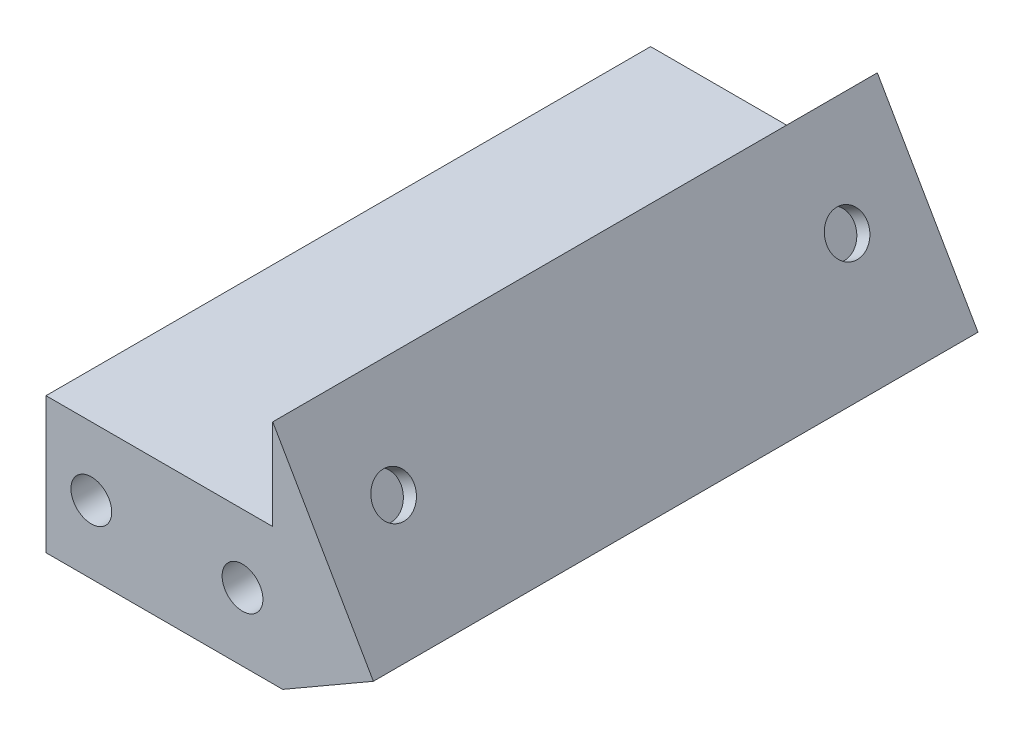
ISO-10303-21;
HEADER;
FILE_DESCRIPTION(('STEP AP214'),'2;1');
FILE_NAME('part.step','',(''),(''),'','','');
FILE_SCHEMA(('AUTOMOTIVE_DESIGN { 1 0 10303 214 1 1 1 1 }'));
ENDSEC;
DATA;
#1=APPLICATION_CONTEXT('core data for automotive mechanical design processes');
#2=APPLICATION_PROTOCOL_DEFINITION('international standard','automotive_design',2000,#1);
#3=PRODUCT_CONTEXT('',#1,'mechanical');
#4=PRODUCT('Part','Part','',(#3));
#5=PRODUCT_RELATED_PRODUCT_CATEGORY('part','',(#4));
#6=PRODUCT_DEFINITION_FORMATION('','',#4);
#7=PRODUCT_DEFINITION_CONTEXT('part definition',#1,'design');
#8=PRODUCT_DEFINITION('design','',#6,#7);
#9=PRODUCT_DEFINITION_SHAPE('','',#8);
#10=(LENGTH_UNIT() NAMED_UNIT(*) SI_UNIT(.MILLI.,.METRE.));
#11=(NAMED_UNIT(*) PLANE_ANGLE_UNIT() SI_UNIT($,.RADIAN.));
#12=(NAMED_UNIT(*) SI_UNIT($,.STERADIAN.) SOLID_ANGLE_UNIT());
#13=UNCERTAINTY_MEASURE_WITH_UNIT(LENGTH_MEASURE(1.E-05),#10,'distance_accuracy_value','');
#14=(GEOMETRIC_REPRESENTATION_CONTEXT(3) GLOBAL_UNCERTAINTY_ASSIGNED_CONTEXT((#13)) GLOBAL_UNIT_ASSIGNED_CONTEXT((#10,
#11,#12)) REPRESENTATION_CONTEXT('',''));
#15=CARTESIAN_POINT('',(0.,0.,0.));
#16=DIRECTION('',(0.,0.,1.));
#17=DIRECTION('',(1.,0.,0.));
#18=AXIS2_PLACEMENT_3D('',#15,#16,#17);
#19=CARTESIAN_POINT('',(0.,0.,40.));
#20=DIRECTION('',(1.,0.,0.));
#21=DIRECTION('',(0.,1.,0.));
#22=AXIS2_PLACEMENT_3D('',#19,#20,#21);
#23=PLANE('',#22);
#24=DIRECTION('',(0.,-1.,0.));
#25=VECTOR('',#24,1.);
#26=CARTESIAN_POINT('',(0.,0.,0.));
#27=LINE('',#26,#25);
#28=CARTESIAN_POINT('',(0.,0.,0.));
#29=VERTEX_POINT('',#28);
#30=CARTESIAN_POINT('',(0.,-8.99999999999998,0.));
#31=VERTEX_POINT('',#30);
#32=EDGE_CURVE('E117',#29,#31,#27,.T.);
#33=ORIENTED_EDGE('',*,*,#32,.T.);
#34=DIRECTION('',(0.,0.,-1.));
#35=VECTOR('',#34,1.);
#36=CARTESIAN_POINT('',(0.,-8.99999999999998,40.));
#37=LINE('',#36,#35);
#38=CARTESIAN_POINT('',(0.,-8.99999999999998,40.));
#39=VERTEX_POINT('',#38);
#40=EDGE_CURVE('E11',#39,#31,#37,.T.);
#41=ORIENTED_EDGE('',*,*,#40,.F.);
#42=DIRECTION('',(0.,-1.,0.));
#43=VECTOR('',#42,1.);
#44=CARTESIAN_POINT('',(0.,0.,40.));
#45=LINE('',#44,#43);
#46=CARTESIAN_POINT('',(0.,0.,40.));
#47=VERTEX_POINT('',#46);
#48=EDGE_CURVE('E128',#47,#39,#45,.T.);
#49=ORIENTED_EDGE('',*,*,#48,.F.);
#50=DIRECTION('',(0.,0.,-1.));
#51=VECTOR('',#50,1.);
#52=CARTESIAN_POINT('',(0.,0.,40.));
#53=LINE('',#52,#51);
#54=EDGE_CURVE('E113',#47,#29,#53,.T.);
#55=ORIENTED_EDGE('',*,*,#54,.T.);
#56=EDGE_LOOP('',(#33,#41,#49,#55));
#57=FACE_BOUND('',#56,.T.);
#58=ADVANCED_FACE('F33',(#57),#23,.F.);
#59=CARTESIAN_POINT('',(0.,-8.99999999999998,40.));
#60=DIRECTION('',(0.,1.,0.));
#61=DIRECTION('',(-1.,0.,0.));
#62=AXIS2_PLACEMENT_3D('',#59,#60,#61);
#63=PLANE('',#62);
#64=DIRECTION('',(1.,0.,0.));
#65=VECTOR('',#64,1.);
#66=CARTESIAN_POINT('',(0.,-8.99999999999998,0.));
#67=LINE('',#66,#65);
#68=CARTESIAN_POINT('',(15.6602540378444,-8.99999999999998,0.));
#69=VERTEX_POINT('',#68);
#70=EDGE_CURVE('E120',#31,#69,#67,.T.);
#71=ORIENTED_EDGE('',*,*,#70,.T.);
#72=DIRECTION('',(0.,0.,-1.));
#73=VECTOR('',#72,1.);
#74=CARTESIAN_POINT('',(15.6602540378444,-8.99999999999998,40.));
#75=LINE('',#74,#73);
#76=CARTESIAN_POINT('',(15.6602540378444,-8.99999999999998,40.));
#77=VERTEX_POINT('',#76);
#78=EDGE_CURVE('E41',#77,#69,#75,.T.);
#79=ORIENTED_EDGE('',*,*,#78,.F.);
#80=DIRECTION('',(1.,0.,0.));
#81=VECTOR('',#80,1.);
#82=CARTESIAN_POINT('',(0.,-8.99999999999998,40.));
#83=LINE('',#82,#81);
#84=EDGE_CURVE('E86',#39,#77,#83,.T.);
#85=ORIENTED_EDGE('',*,*,#84,.F.);
#86=ORIENTED_EDGE('',*,*,#40,.T.);
#87=EDGE_LOOP('',(#71,#79,#85,#86));
#88=FACE_BOUND('',#87,.T.);
#89=ADVANCED_FACE('F154',(#88),#63,.F.);
#90=CARTESIAN_POINT('',(21.6602540378444,-5.53589838486222,40.));
#91=DIRECTION('',(-0.5,0.866025403784439,0.));
#92=DIRECTION('',(-0.866025403784439,-0.5,0.));
#93=AXIS2_PLACEMENT_3D('',#90,#91,#92);
#94=PLANE('',#93);
#95=DIRECTION('',(0.866025403784439,0.5,0.));
#96=VECTOR('',#95,1.);
#97=CARTESIAN_POINT('',(21.6602540378444,-5.53589838486222,0.));
#98=LINE('',#97,#96);
#99=CARTESIAN_POINT('',(21.6602540378444,-5.53589838486222,0.));
#100=VERTEX_POINT('',#99);
#101=EDGE_CURVE('E123',#69,#100,#98,.T.);
#102=ORIENTED_EDGE('',*,*,#101,.T.);
#103=DIRECTION('',(0.,0.,-1.));
#104=VECTOR('',#103,1.);
#105=CARTESIAN_POINT('',(21.6602540378444,-5.53589838486222,40.));
#106=LINE('',#105,#104);
#107=CARTESIAN_POINT('',(21.6602540378444,-5.53589838486222,40.));
#108=VERTEX_POINT('',#107);
#109=EDGE_CURVE('E108',#108,#100,#106,.T.);
#110=ORIENTED_EDGE('',*,*,#109,.F.);
#111=DIRECTION('',(0.866025403784439,0.5,0.));
#112=VECTOR('',#111,1.);
#113=CARTESIAN_POINT('',(21.6602540378444,-5.53589838486222,40.));
#114=LINE('',#113,#112);
#115=EDGE_CURVE('E99',#77,#108,#114,.T.);
#116=ORIENTED_EDGE('',*,*,#115,.F.);
#117=ORIENTED_EDGE('',*,*,#78,.T.);
#118=EDGE_LOOP('',(#102,#110,#116,#117));
#119=FACE_BOUND('',#118,.T.);
#120=ADVANCED_FACE('F134',(#119),#94,.F.);
#121=CARTESIAN_POINT('',(15.,6.,40.));
#122=DIRECTION('',(-0.866025403784439,-0.5,0.));
#123=DIRECTION('',(0.5,-0.866025403784439,0.));
#124=AXIS2_PLACEMENT_3D('',#121,#122,#123);
#125=PLANE('',#124);
#126=CARTESIAN_POINT('',(18.0000000013533,0.803847574949357,35.));
#127=DIRECTION('',(-0.866025403784439,-0.5,0.));
#128=DIRECTION('',(-0.5,0.866025403784439,0.));
#129=AXIS2_PLACEMENT_3D('',#126,#127,#128);
#130=CIRCLE('',#129,1.35);
#131=CARTESIAN_POINT('',(17.3250000013533,1.97298187005835,35.));
#132=VERTEX_POINT('',#131);
#133=EDGE_CURVE('E170',#132,#132,#130,.T.);
#134=ORIENTED_EDGE('',*,*,#133,.T.);
#135=EDGE_LOOP('',(#134));
#136=FACE_BOUND('',#135,.T.);
#137=CARTESIAN_POINT('',(18.0000000013533,0.803847574949357,5.));
#138=DIRECTION('',(0.866025403784439,0.5,0.));
#139=DIRECTION('',(-0.5,0.866025403784439,0.));
#140=AXIS2_PLACEMENT_3D('',#137,#138,#139);
#141=CIRCLE('',#140,1.35);
#142=CARTESIAN_POINT('',(17.3250000013533,1.97298187005835,5.));
#143=VERTEX_POINT('',#142);
#144=EDGE_CURVE('E173',#143,#143,#141,.T.);
#145=ORIENTED_EDGE('',*,*,#144,.F.);
#146=EDGE_LOOP('',(#145));
#147=FACE_BOUND('',#146,.T.);
#148=DIRECTION('',(-0.5,0.866025403784439,0.));
#149=VECTOR('',#148,1.);
#150=CARTESIAN_POINT('',(15.,6.,0.));
#151=LINE('',#150,#149);
#152=CARTESIAN_POINT('',(15.,6.,0.));
#153=VERTEX_POINT('',#152);
#154=EDGE_CURVE('E107',#100,#153,#151,.T.);
#155=ORIENTED_EDGE('',*,*,#154,.T.);
#156=DIRECTION('',(0.,0.,-1.));
#157=VECTOR('',#156,1.);
#158=CARTESIAN_POINT('',(15.,6.,40.));
#159=LINE('',#158,#157);
#160=CARTESIAN_POINT('',(15.,6.,40.));
#161=VERTEX_POINT('',#160);
#162=EDGE_CURVE('E104',#161,#153,#159,.T.);
#163=ORIENTED_EDGE('',*,*,#162,.F.);
#164=DIRECTION('',(-0.5,0.866025403784439,0.));
#165=VECTOR('',#164,1.);
#166=CARTESIAN_POINT('',(15.,6.,40.));
#167=LINE('',#166,#165);
#168=EDGE_CURVE('E93',#108,#161,#167,.T.);
#169=ORIENTED_EDGE('',*,*,#168,.F.);
#170=ORIENTED_EDGE('',*,*,#109,.T.);
#171=EDGE_LOOP('',(#155,#163,#169,#170));
#172=FACE_BOUND('',#171,.T.);
#173=ADVANCED_FACE('F105',(#136,#147,#172),#125,.F.);
#174=CARTESIAN_POINT('',(15.,0.,40.));
#175=DIRECTION('',(1.,0.,0.));
#176=DIRECTION('',(0.,0.,-1.));
#177=AXIS2_PLACEMENT_3D('',#174,#175,#176);
#178=PLANE('',#177);
#179=DIRECTION('',(0.,-1.,0.));
#180=VECTOR('',#179,1.);
#181=CARTESIAN_POINT('',(15.,0.,0.));
#182=LINE('',#181,#180);
#183=CARTESIAN_POINT('',(15.,0.,0.));
#184=VERTEX_POINT('',#183);
#185=EDGE_CURVE('E72',#153,#184,#182,.T.);
#186=ORIENTED_EDGE('',*,*,#185,.T.);
#187=DIRECTION('',(0.,0.,-1.));
#188=VECTOR('',#187,1.);
#189=CARTESIAN_POINT('',(15.,0.,40.));
#190=LINE('',#189,#188);
#191=CARTESIAN_POINT('',(15.,0.,40.));
#192=VERTEX_POINT('',#191);
#193=EDGE_CURVE('E109',#192,#184,#190,.T.);
#194=ORIENTED_EDGE('',*,*,#193,.F.);
#195=DIRECTION('',(0.,-1.,0.));
#196=VECTOR('',#195,1.);
#197=CARTESIAN_POINT('',(15.,0.,40.));
#198=LINE('',#197,#196);
#199=EDGE_CURVE('E97',#161,#192,#198,.T.);
#200=ORIENTED_EDGE('',*,*,#199,.F.);
#201=ORIENTED_EDGE('',*,*,#162,.T.);
#202=EDGE_LOOP('',(#186,#194,#200,#201));
#203=FACE_BOUND('',#202,.T.);
#204=ADVANCED_FACE('F111',(#203),#178,.F.);
#205=CARTESIAN_POINT('',(0.,0.,40.));
#206=DIRECTION('',(0.,-1.,0.));
#207=DIRECTION('',(0.,0.,-1.));
#208=AXIS2_PLACEMENT_3D('',#205,#206,#207);
#209=PLANE('',#208);
#210=DIRECTION('',(-1.,0.,0.));
#211=VECTOR('',#210,1.);
#212=CARTESIAN_POINT('',(0.,0.,0.));
#213=LINE('',#212,#211);
#214=EDGE_CURVE('E78',#184,#29,#213,.T.);
#215=ORIENTED_EDGE('',*,*,#214,.T.);
#216=ORIENTED_EDGE('',*,*,#54,.F.);
#217=DIRECTION('',(-1.,0.,0.));
#218=VECTOR('',#217,1.);
#219=CARTESIAN_POINT('',(0.,0.,40.));
#220=LINE('',#219,#218);
#221=EDGE_CURVE('E49',#192,#47,#220,.T.);
#222=ORIENTED_EDGE('',*,*,#221,.F.);
#223=ORIENTED_EDGE('',*,*,#193,.T.);
#224=EDGE_LOOP('',(#215,#216,#222,#223));
#225=FACE_BOUND('',#224,.T.);
#226=ADVANCED_FACE('F141',(#225),#209,.F.);
#227=CARTESIAN_POINT('',(0.,0.,40.));
#228=DIRECTION('',(0.,0.,1.));
#229=DIRECTION('',(1.,0.,0.));
#230=AXIS2_PLACEMENT_3D('',#227,#228,#229);
#231=PLANE('',#230);
#232=CARTESIAN_POINT('',(13.,-4.49999999999999,40.));
#233=DIRECTION('',(0.,0.,1.));
#234=DIRECTION('',(1.,0.,0.));
#235=AXIS2_PLACEMENT_3D('',#232,#233,#234);
#236=CIRCLE('',#235,1.35);
#237=CARTESIAN_POINT('',(14.35,-4.49999999999999,40.));
#238=VERTEX_POINT('',#237);
#239=EDGE_CURVE('E192',#238,#238,#236,.T.);
#240=ORIENTED_EDGE('',*,*,#239,.F.);
#241=EDGE_LOOP('',(#240));
#242=FACE_BOUND('',#241,.T.);
#243=CARTESIAN_POINT('',(3.,-4.49999999999999,40.));
#244=DIRECTION('',(0.,0.,1.));
#245=DIRECTION('',(1.,0.,0.));
#246=AXIS2_PLACEMENT_3D('',#243,#244,#245);
#247=CIRCLE('',#246,1.35);
#248=CARTESIAN_POINT('',(4.35,-4.49999999999999,40.));
#249=VERTEX_POINT('',#248);
#250=EDGE_CURVE('E186',#249,#249,#247,.T.);
#251=ORIENTED_EDGE('',*,*,#250,.F.);
#252=EDGE_LOOP('',(#251));
#253=FACE_BOUND('',#252,.T.);
#254=ORIENTED_EDGE('',*,*,#48,.T.);
#255=ORIENTED_EDGE('',*,*,#84,.T.);
#256=ORIENTED_EDGE('',*,*,#115,.T.);
#257=ORIENTED_EDGE('',*,*,#168,.T.);
#258=ORIENTED_EDGE('',*,*,#199,.T.);
#259=ORIENTED_EDGE('',*,*,#221,.T.);
#260=EDGE_LOOP('',(#254,#255,#256,#257,#258,#259));
#261=FACE_BOUND('',#260,.T.);
#262=ADVANCED_FACE('F95',(#242,#253,#261),#231,.T.);
#263=CARTESIAN_POINT('',(0.,0.,0.));
#264=DIRECTION('',(0.,0.,1.));
#265=DIRECTION('',(1.,0.,0.));
#266=AXIS2_PLACEMENT_3D('',#263,#264,#265);
#267=PLANE('',#266);
#268=CARTESIAN_POINT('',(13.,-4.49999999999999,0.));
#269=DIRECTION('',(0.,0.,1.));
#270=DIRECTION('',(1.,0.,0.));
#271=AXIS2_PLACEMENT_3D('',#268,#269,#270);
#272=CIRCLE('',#271,1.35);
#273=CARTESIAN_POINT('',(14.35,-4.49999999999999,0.));
#274=VERTEX_POINT('',#273);
#275=EDGE_CURVE('E189',#274,#274,#272,.T.);
#276=ORIENTED_EDGE('',*,*,#275,.T.);
#277=EDGE_LOOP('',(#276));
#278=FACE_BOUND('',#277,.T.);
#279=CARTESIAN_POINT('',(3.,-4.49999999999999,0.));
#280=DIRECTION('',(0.,0.,1.));
#281=DIRECTION('',(1.,0.,0.));
#282=AXIS2_PLACEMENT_3D('',#279,#280,#281);
#283=CIRCLE('',#282,1.35);
#284=CARTESIAN_POINT('',(4.35,-4.49999999999999,0.));
#285=VERTEX_POINT('',#284);
#286=EDGE_CURVE('E184',#285,#285,#283,.T.);
#287=ORIENTED_EDGE('',*,*,#286,.T.);
#288=EDGE_LOOP('',(#287));
#289=FACE_BOUND('',#288,.T.);
#290=ORIENTED_EDGE('',*,*,#32,.F.);
#291=ORIENTED_EDGE('',*,*,#214,.F.);
#292=ORIENTED_EDGE('',*,*,#185,.F.);
#293=ORIENTED_EDGE('',*,*,#154,.F.);
#294=ORIENTED_EDGE('',*,*,#101,.F.);
#295=ORIENTED_EDGE('',*,*,#70,.F.);
#296=EDGE_LOOP('',(#290,#291,#292,#293,#294,#295));
#297=FACE_BOUND('',#296,.T.);
#298=ADVANCED_FACE('F137',(#278,#289,#297),#267,.F.);
#299=CARTESIAN_POINT('',(17.1339745975689,0.303847574949357,5.));
#300=DIRECTION('',(0.866025403784439,0.5,0.));
#301=DIRECTION('',(-0.5,0.866025403784439,0.));
#302=AXIS2_PLACEMENT_3D('',#299,#300,#301);
#303=CYLINDRICAL_SURFACE('',#302,1.35);
#304=CARTESIAN_POINT('',(17.1339745975689,0.303847574949357,5.));
#305=DIRECTION('',(0.866025403784439,0.5,0.));
#306=DIRECTION('',(-0.5,0.866025403784439,0.));
#307=AXIS2_PLACEMENT_3D('',#304,#305,#306);
#308=CIRCLE('',#307,1.35);
#309=CARTESIAN_POINT('',(16.4589745975689,1.47298187005835,5.));
#310=VERTEX_POINT('',#309);
#311=EDGE_CURVE('E121',#310,#310,#308,.T.);
#312=ORIENTED_EDGE('',*,*,#311,.F.);
#313=EDGE_LOOP('',(#312));
#314=FACE_BOUND('',#313,.T.);
#315=ORIENTED_EDGE('',*,*,#144,.T.);
#316=EDGE_LOOP('',(#315));
#317=FACE_BOUND('',#316,.T.);
#318=ADVANCED_FACE('F227',(#314,#317),#303,.F.);
#319=CARTESIAN_POINT('',(17.1339745975689,0.303847574949357,5.));
#320=DIRECTION('',(0.866025403784439,0.5,0.));
#321=DIRECTION('',(-0.5,0.866025403784439,0.));
#322=AXIS2_PLACEMENT_3D('',#319,#320,#321);
#323=PLANE('',#322);
#324=ORIENTED_EDGE('',*,*,#311,.T.);
#325=EDGE_LOOP('',(#324));
#326=FACE_BOUND('',#325,.T.);
#327=ADVANCED_FACE('F223',(#326),#323,.T.);
#328=CARTESIAN_POINT('',(17.1339745975689,0.303847574949357,35.));
#329=DIRECTION('',(0.866025403784439,0.5,0.));
#330=DIRECTION('',(-0.5,0.866025403784439,0.));
#331=AXIS2_PLACEMENT_3D('',#328,#329,#330);
#332=CYLINDRICAL_SURFACE('',#331,1.35);
#333=CARTESIAN_POINT('',(17.1339745975689,0.303847574949357,35.));
#334=DIRECTION('',(-0.866025403784439,-0.5,0.));
#335=DIRECTION('',(-0.5,0.866025403784439,0.));
#336=AXIS2_PLACEMENT_3D('',#333,#334,#335);
#337=CIRCLE('',#336,1.35);
#338=CARTESIAN_POINT('',(16.4589745975689,1.47298187005835,35.));
#339=VERTEX_POINT('',#338);
#340=EDGE_CURVE('E175',#339,#339,#337,.T.);
#341=ORIENTED_EDGE('',*,*,#340,.T.);
#342=EDGE_LOOP('',(#341));
#343=FACE_BOUND('',#342,.T.);
#344=ORIENTED_EDGE('',*,*,#133,.F.);
#345=EDGE_LOOP('',(#344));
#346=FACE_BOUND('',#345,.T.);
#347=ADVANCED_FACE('F216',(#343,#346),#332,.F.);
#348=CARTESIAN_POINT('',(17.1339745975689,0.303847574949357,35.));
#349=DIRECTION('',(0.866025403784439,0.5,0.));
#350=DIRECTION('',(-0.5,0.866025403784439,0.));
#351=AXIS2_PLACEMENT_3D('',#348,#349,#350);
#352=PLANE('',#351);
#353=ORIENTED_EDGE('',*,*,#340,.F.);
#354=EDGE_LOOP('',(#353));
#355=FACE_BOUND('',#354,.T.);
#356=ADVANCED_FACE('F210',(#355),#352,.T.);
#357=CARTESIAN_POINT('',(3.,-4.49999999999999,0.));
#358=DIRECTION('',(0.,0.,1.));
#359=DIRECTION('',(1.,0.,0.));
#360=AXIS2_PLACEMENT_3D('',#357,#358,#359);
#361=CYLINDRICAL_SURFACE('',#360,1.35);
#362=ORIENTED_EDGE('',*,*,#286,.F.);
#363=EDGE_LOOP('',(#362));
#364=FACE_BOUND('',#363,.T.);
#365=ORIENTED_EDGE('',*,*,#250,.T.);
#366=EDGE_LOOP('',(#365));
#367=FACE_BOUND('',#366,.T.);
#368=ADVANCED_FACE('F203',(#364,#367),#361,.F.);
#369=CARTESIAN_POINT('',(13.,-4.49999999999999,0.));
#370=DIRECTION('',(0.,0.,1.));
#371=DIRECTION('',(1.,0.,0.));
#372=AXIS2_PLACEMENT_3D('',#369,#370,#371);
#373=CYLINDRICAL_SURFACE('',#372,1.35);
#374=ORIENTED_EDGE('',*,*,#275,.F.);
#375=EDGE_LOOP('',(#374));
#376=FACE_BOUND('',#375,.T.);
#377=ORIENTED_EDGE('',*,*,#239,.T.);
#378=EDGE_LOOP('',(#377));
#379=FACE_BOUND('',#378,.T.);
#380=ADVANCED_FACE('F200',(#376,#379),#373,.F.);
#381=CLOSED_SHELL('',(#58,#89,#120,#173,#204,#226,#262,#298,#318,#327,#347,#356,#368,#380));
#382=MANIFOLD_SOLID_BREP('B2',#381);
#383=ADVANCED_BREP_SHAPE_REPRESENTATION('',(#18,#382),#14);
#384=SHAPE_DEFINITION_REPRESENTATION(#9,#383);
ENDSEC;
END-ISO-10303-21;
